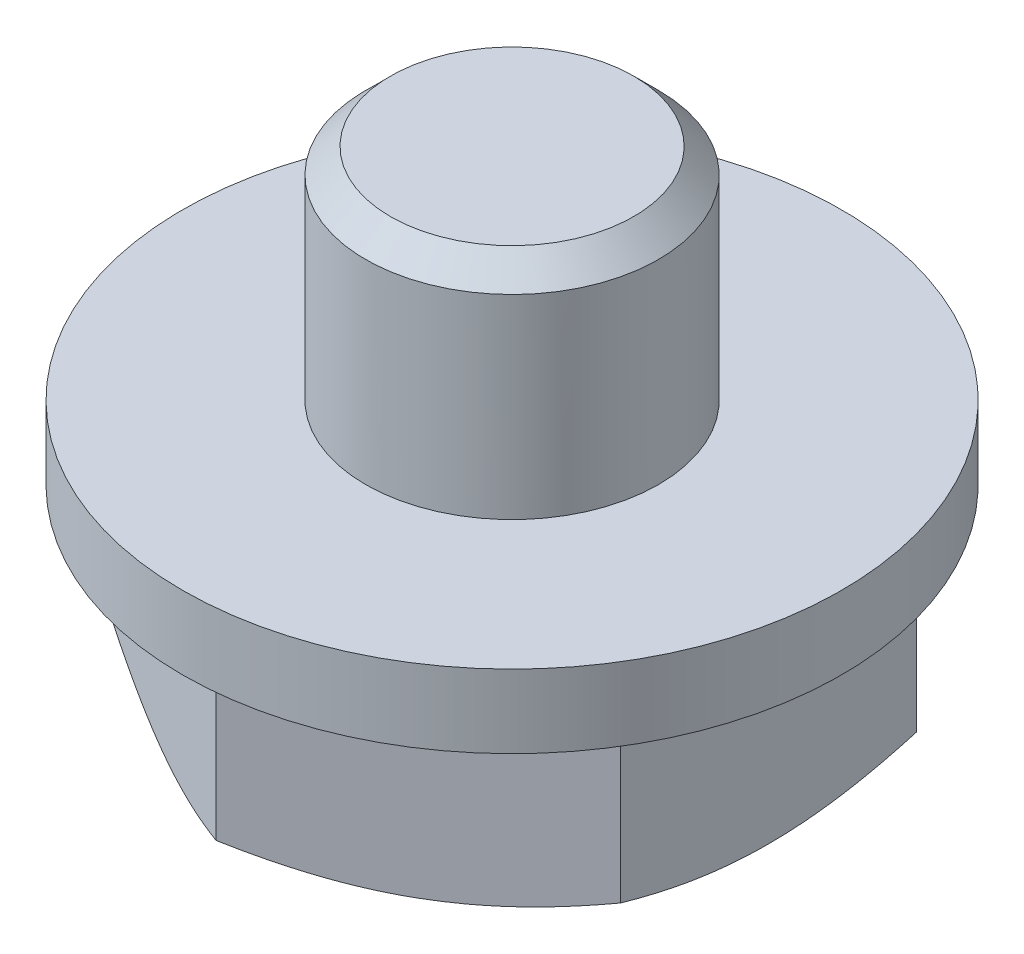
ISO-10303-21;
HEADER;
FILE_DESCRIPTION(('STEP AP214'),'2;1');
FILE_NAME('part.step','',(''),(''),'','','');
FILE_SCHEMA(('AUTOMOTIVE_DESIGN { 1 0 10303 214 1 1 1 1 }'));
ENDSEC;
DATA;
#1=APPLICATION_CONTEXT('core data for automotive mechanical design processes');
#2=APPLICATION_PROTOCOL_DEFINITION('international standard','automotive_design',2000,#1);
#3=PRODUCT_CONTEXT('',#1,'mechanical');
#4=PRODUCT('Part','Part','',(#3));
#5=PRODUCT_RELATED_PRODUCT_CATEGORY('part','',(#4));
#6=PRODUCT_DEFINITION_FORMATION('','',#4);
#7=PRODUCT_DEFINITION_CONTEXT('part definition',#1,'design');
#8=PRODUCT_DEFINITION('design','',#6,#7);
#9=PRODUCT_DEFINITION_SHAPE('','',#8);
#10=(LENGTH_UNIT() NAMED_UNIT(*) SI_UNIT(.MILLI.,.METRE.));
#11=(NAMED_UNIT(*) PLANE_ANGLE_UNIT() SI_UNIT($,.RADIAN.));
#12=(NAMED_UNIT(*) SI_UNIT($,.STERADIAN.) SOLID_ANGLE_UNIT());
#13=UNCERTAINTY_MEASURE_WITH_UNIT(LENGTH_MEASURE(1.E-05),#10,'distance_accuracy_value','');
#14=(GEOMETRIC_REPRESENTATION_CONTEXT(3) GLOBAL_UNCERTAINTY_ASSIGNED_CONTEXT((#13)) GLOBAL_UNIT_ASSIGNED_CONTEXT((#10,
#11,#12)) REPRESENTATION_CONTEXT('',''));
#15=CARTESIAN_POINT('',(0.,0.,0.));
#16=DIRECTION('',(0.,0.,1.));
#17=DIRECTION('',(1.,0.,0.));
#18=AXIS2_PLACEMENT_3D('',#15,#16,#17);
#19=CARTESIAN_POINT('',(0.,5.,8.08290376865476));
#20=DIRECTION('',(-0.5,0.,-0.866025403784438));
#21=DIRECTION('',(-0.866025403784438,0.,0.5));
#22=AXIS2_PLACEMENT_3D('',#19,#20,#21);
#23=PLANE('',#22);
#24=CARTESIAN_POINT('',(7.0002,0.625281450434499,4.04133641427354));
#25=CARTESIAN_POINT('',(6.84633209670661,0.573999847053485,4.13017208965962));
#26=CARTESIAN_POINT('',(6.69189049944575,0.525045594003585,4.21933898741225));
#27=CARTESIAN_POINT('',(6.38175307364675,0.432432787270134,4.39839691368309));
#28=CARTESIAN_POINT('',(6.22605673470458,0.388776518079361,4.48828823688318));
#29=CARTESIAN_POINT('',(5.75647483041754,0.266611592179494,4.75940147572989));
#30=CARTESIAN_POINT('',(5.4407356672622,0.19712555689495,4.94169356657133));
#31=CARTESIAN_POINT('',(4.96823775523367,0.115644956399095,5.21449036327254));
#32=CARTESIAN_POINT('',(4.81289077574251,0.0924334848814715,5.30417998369955));
#33=CARTESIAN_POINT('',(4.50149488763784,0.053511214432459,5.48396448352133));
#34=CARTESIAN_POINT('',(4.34544604227359,0.0377997527795268,5.57405932639911));
#35=CARTESIAN_POINT('',(4.03307732990483,0.0142779132830579,5.75440548657163));
#36=CARTESIAN_POINT('',(3.87675797306999,0.00645856866286302,5.84465650931977));
#37=CARTESIAN_POINT('',(3.56398349199213,-0.00111975822769417,6.02523694016572));
#38=CARTESIAN_POINT('',(3.40752837209266,-0.000878989506014234,6.11556634575577));
#39=CARTESIAN_POINT('',(2.97889312781607,0.0108597318156005,6.36303901942303));
#40=CARTESIAN_POINT('',(2.7068533171146,0.0305657427429161,6.52010127736181));
#41=CARTESIAN_POINT('',(2.1645805599178,0.0930534601257693,6.83318259970358));
#42=CARTESIAN_POINT('',(1.89434952048172,0.135856524112985,6.9892005630654));
#43=CARTESIAN_POINT('',(1.35098545806016,0.242851679710361,7.30291195077245));
#44=CARTESIAN_POINT('',(1.07792099669016,0.307497094569668,7.46056579105055));
#45=CARTESIAN_POINT('',(0.535864215009371,0.454216071847038,7.77352241987001));
#46=CARTESIAN_POINT('',(0.26686495284856,0.536255171025564,7.92882921629037));
#47=CARTESIAN_POINT('',(-0.000200000000000435,0.625281450434501,8.0830192387086));
#48=B_SPLINE_CURVE_WITH_KNOTS('',3,(#24,#25,#26,#27,#28,#29,#30,#31,#32,#33,#34,#35,#36,#37,#38,
#39,#40,#41,#42,#43,#44,#45,#46,#47),.UNSPECIFIED.,.F.,.F.,(4,2,2,2,2,2,2,2,2,2,2,4),(0.,
0.554727910214694,1.10969417576209,2.2219327402719,2.76443041023617,3.30688013473357,
3.8487128486711,4.39052882332379,5.33376515141419,6.27787517570456,7.2429241888324,
8.20607866430097),.UNSPECIFIED.);
#49=CARTESIAN_POINT('',(7.,0.625214782339281,4.04145188432738));
#50=VERTEX_POINT('',#49);
#51=CARTESIAN_POINT('',(3.5,0.,6.06217782649107));
#52=VERTEX_POINT('',#51);
#53=EDGE_CURVE('E190',#50,#52,#48,.T.);
#54=ORIENTED_EDGE('',*,*,#53,.F.);
#55=DIRECTION('',(0.,-1.,0.));
#56=VECTOR('',#55,1.);
#57=CARTESIAN_POINT('',(7.,5.,4.04145188432738));
#58=LINE('',#57,#56);
#59=CARTESIAN_POINT('',(7.,5.,4.04145188432738));
#60=VERTEX_POINT('',#59);
#61=EDGE_CURVE('E125',#60,#50,#58,.T.);
#62=ORIENTED_EDGE('',*,*,#61,.F.);
#63=DIRECTION('',(0.866025403784438,0.,-0.5));
#64=VECTOR('',#63,1.);
#65=CARTESIAN_POINT('',(0.,5.,8.08290376865476));
#66=LINE('',#65,#64);
#67=CARTESIAN_POINT('',(0.,5.,8.08290376865476));
#68=VERTEX_POINT('',#67);
#69=EDGE_CURVE('E119',#68,#60,#66,.T.);
#70=ORIENTED_EDGE('',*,*,#69,.F.);
#71=DIRECTION('',(0.,-1.,0.));
#72=VECTOR('',#71,1.);
#73=CARTESIAN_POINT('',(0.,5.,8.08290376865476));
#74=LINE('',#73,#72);
#75=CARTESIAN_POINT('',(0.,0.625214782339283,8.08290376865476));
#76=VERTEX_POINT('',#75);
#77=EDGE_CURVE('E123',#68,#76,#74,.T.);
#78=ORIENTED_EDGE('',*,*,#77,.T.);
#79=EDGE_CURVE('E195',#52,#76,#48,.T.);
#80=ORIENTED_EDGE('',*,*,#79,.F.);
#81=EDGE_LOOP('',(#54,#62,#70,#78,#80));
#82=FACE_BOUND('',#81,.T.);
#83=ADVANCED_FACE('F44',(#82),#23,.F.);
#84=CARTESIAN_POINT('',(7.,5.,4.04145188432738));
#85=DIRECTION('',(-1.,0.,0.));
#86=DIRECTION('',(0.,0.,1.));
#87=AXIS2_PLACEMENT_3D('',#84,#85,#86);
#88=PLANE('',#87);
#89=CARTESIAN_POINT('',(7.,4.76186404389195,-13.5460368372496));
#90=CARTESIAN_POINT('',(7.,4.59953780210596,-13.2295153826755));
#91=CARTESIAN_POINT('',(7.,4.4381256840516,-12.9125209039772));
#92=CARTESIAN_POINT('',(7.,4.11758692070952,-12.2773712054365));
#93=CARTESIAN_POINT('',(7.,3.95846032148225,-11.9592159623624));
#94=CARTESIAN_POINT('',(7.,3.64269167260153,-11.3210077345449));
#95=CARTESIAN_POINT('',(7.,3.48605424029042,-11.0009524611555));
#96=CARTESIAN_POINT('',(7.,3.17616592200302,-10.3591982690968));
#97=CARTESIAN_POINT('',(7.,3.02291508499555,-10.0374993267433));
#98=CARTESIAN_POINT('',(7.,2.71280106100102,-9.37545685064709));
#99=CARTESIAN_POINT('',(7.,2.55616035775235,-9.03500880298386));
#100=CARTESIAN_POINT('',(7.,2.2487810940349,-8.35147052079473));
#101=CARTESIAN_POINT('',(7.,2.09804222846701,-8.00838042395138));
#102=CARTESIAN_POINT('',(7.,1.80424349702592,-7.31918629701299));
#103=CARTESIAN_POINT('',(7.,1.66117848684679,-6.97308447144641));
#104=CARTESIAN_POINT('',(7.,1.38487440517615,-6.2768600213621));
#105=CARTESIAN_POINT('',(7.,1.25163769078746,-5.92673645543603));
#106=CARTESIAN_POINT('',(7.,0.976391123196062,-5.16146853709764));
#107=CARTESIAN_POINT('',(7.,0.836781665778038,-4.74545047840344));
#108=CARTESIAN_POINT('',(7.,0.582028097696016,-3.9060049168917));
#109=CARTESIAN_POINT('',(7.,0.466871294943943,-3.48258138201032));
#110=CARTESIAN_POINT('',(7.,0.319791842460674,-2.84573204597296));
#111=CARTESIAN_POINT('',(7.,0.275348387229164,-2.63518623620514));
#112=CARTESIAN_POINT('',(7.,0.1954774344518,-2.21237703973441));
#113=CARTESIAN_POINT('',(7.,0.160049705051499,-2.00011369734559));
#114=CARTESIAN_POINT('',(7.,0.0992290134753463,-1.57424302626459));
#115=CARTESIAN_POINT('',(7.,0.0738313681719133,-1.36063637221839));
#116=CARTESIAN_POINT('',(7.,0.0338698178703799,-0.932402784004368));
#117=CARTESIAN_POINT('',(7.,0.0193058329548889,-0.717775857374617));
#118=CARTESIAN_POINT('',(7.,0.00141701333636069,-0.285369076932571));
#119=CARTESIAN_POINT('',(7.,-0.00176554239820333,-0.0675832546729947));
#120=CARTESIAN_POINT('',(7.,0.00362428132782249,0.367840497975387));
#121=CARTESIAN_POINT('',(7.,0.0121966850484971,0.585478428058042));
#122=CARTESIAN_POINT('',(7.,0.0407823268781626,1.02006381398484));
#123=CARTESIAN_POINT('',(7.,0.0607990881427077,1.23701103650309));
#124=CARTESIAN_POINT('',(7.,0.111568807963856,1.66962460962952));
#125=CARTESIAN_POINT('',(7.,0.142322020515911,1.88529092981224));
#126=CARTESIAN_POINT('',(7.,0.250675664736702,2.53831636957404));
#127=CARTESIAN_POINT('',(7.,0.343748834818823,2.9731610376597));
#128=CARTESIAN_POINT('',(7.,0.50685007369016,3.61922913910829));
#129=CARTESIAN_POINT('',(7.,0.565146631274929,3.83359493995912));
#130=CARTESIAN_POINT('',(7.,0.688481593292126,4.26038362358347));
#131=CARTESIAN_POINT('',(7.,0.75351973266618,4.47280658238652));
#132=CARTESIAN_POINT('',(7.,0.948541479237103,5.08022368632156));
#133=CARTESIAN_POINT('',(7.,1.08570596276457,5.47290614563571));
#134=CARTESIAN_POINT('',(7.,1.37482615831473,6.25279728985024));
#135=CARTESIAN_POINT('',(7.,1.52678505575987,6.64000477527549));
#136=CARTESIAN_POINT('',(7.,1.84181886345993,7.41030073595152));
#137=CARTESIAN_POINT('',(7.,2.00490486186942,7.79338464875808));
#138=CARTESIAN_POINT('',(7.,2.33929487037032,8.55588763711016));
#139=CARTESIAN_POINT('',(7.,2.5105981529079,8.93530703354955));
#140=CARTESIAN_POINT('',(7.,2.8499471924755,9.67058271208653));
#141=CARTESIAN_POINT('',(7.,3.01765935181496,10.0265935321464));
#142=CARTESIAN_POINT('',(7.,3.35749698518692,10.7365109095522));
#143=CARTESIAN_POINT('',(7.,3.52962259093656,11.0904174037064));
#144=CARTESIAN_POINT('',(7.,3.87684626845073,11.7954295984827));
#145=CARTESIAN_POINT('',(7.,4.05193371931228,12.1465405418672));
#146=CARTESIAN_POINT('',(7.,4.40493523177394,12.8473035993393));
#147=CARTESIAN_POINT('',(7.,4.58284906047677,13.1969558306595));
#148=CARTESIAN_POINT('',(7.,4.76186404389194,13.5460368372495));
#149=B_SPLINE_CURVE_WITH_KNOTS('',3,(#89,#90,#91,#92,#93,#94,#95,#96,#97,#98,#99,#100,#101,#102,
#103,#104,#105,#106,#107,#108,#109,#110,#111,#112,#113,#114,#115,#116,#117,#118,#119,#120,#121,
#122,#123,#124,#125,#126,#127,#128,#129,#130,#131,#132,#133,#134,#135,#136,#137,#138,#139,#140,
#141,#142,#143,#144,#145,#146,#147,#148),.UNSPECIFIED.,.F.,.F.,(4,2,2,2,2,2,2,2,2,2,2,2,2,2,2,2,
2,2,2,2,2,2,2,2,2,2,2,2,2,4),(0.,1.06715956203656,2.1343406006307,3.20331244605639,
4.2722997382863,5.39652042147248,6.52068291043871,7.64408212888122,8.76774990007881,
10.0837061255838,11.3989776286479,12.0443724838111,12.6897507398901,13.3348273063576,
13.9798991141982,14.6330072977319,15.2861168291634,15.9394275292832,16.5927536860179,
17.9249922966423,18.5913824043789,19.2577463216258,20.5051467366988,21.7528163291848,
23.0017479142594,24.2505691229857,25.4311419925227,26.611750136781,27.7887710271688,
28.9656954274419),.UNSPECIFIED.);
#150=CARTESIAN_POINT('',(7.,0.625214782339283,-4.04145188432738));
#151=VERTEX_POINT('',#150);
#152=CARTESIAN_POINT('',(7.,0.,0.));
#153=VERTEX_POINT('',#152);
#154=EDGE_CURVE('E61',#151,#153,#149,.T.);
#155=ORIENTED_EDGE('',*,*,#154,.F.);
#156=DIRECTION('',(0.,-1.,0.));
#157=VECTOR('',#156,1.);
#158=CARTESIAN_POINT('',(7.,5.,-4.04145188432738));
#159=LINE('',#158,#157);
#160=CARTESIAN_POINT('',(7.,5.,-4.04145188432738));
#161=VERTEX_POINT('',#160);
#162=EDGE_CURVE('E159',#161,#151,#159,.T.);
#163=ORIENTED_EDGE('',*,*,#162,.F.);
#164=DIRECTION('',(0.,0.,-1.));
#165=VECTOR('',#164,1.);
#166=CARTESIAN_POINT('',(7.,5.,4.04145188432738));
#167=LINE('',#166,#165);
#168=EDGE_CURVE('E129',#60,#161,#167,.T.);
#169=ORIENTED_EDGE('',*,*,#168,.F.);
#170=ORIENTED_EDGE('',*,*,#61,.T.);
#171=EDGE_CURVE('E192',#153,#50,#149,.T.);
#172=ORIENTED_EDGE('',*,*,#171,.F.);
#173=EDGE_LOOP('',(#155,#163,#169,#170,#172));
#174=FACE_BOUND('',#173,.T.);
#175=ADVANCED_FACE('F257',(#174),#88,.F.);
#176=CARTESIAN_POINT('',(7.,5.,-4.04145188432738));
#177=DIRECTION('',(-0.5,0.,0.866025403784439));
#178=DIRECTION('',(0.866025403784439,0.,0.5));
#179=AXIS2_PLACEMENT_3D('',#176,#177,#178);
#180=PLANE('',#179);
#181=CARTESIAN_POINT('',(-0.000200000000000029,0.625281450434502,-8.0830192387086));
#182=CARTESIAN_POINT('',(0.153667903293392,0.573999847053488,-7.99418356332252));
#183=CARTESIAN_POINT('',(0.30810950055425,0.525045594003589,-7.90501666556989));
#184=CARTESIAN_POINT('',(0.618246926353254,0.432432787270138,-7.72595873929906));
#185=CARTESIAN_POINT('',(0.773943265295415,0.388776518079365,-7.63606741609896));
#186=CARTESIAN_POINT('',(1.24352516958246,0.266611592179497,-7.36495417725225));
#187=CARTESIAN_POINT('',(1.5592643327378,0.197125556894953,-7.18266208641081));
#188=CARTESIAN_POINT('',(2.03176224476633,0.115644956399098,-6.90986528970961));
#189=CARTESIAN_POINT('',(2.18710922425749,0.092433484881475,-6.82017566928259));
#190=CARTESIAN_POINT('',(2.49850511236216,0.0535112144324625,-6.64039116946081));
#191=CARTESIAN_POINT('',(2.65455395772641,0.0377997527795299,-6.55029632658303));
#192=CARTESIAN_POINT('',(2.96692267009517,0.0142779132830607,-6.36995016641051));
#193=CARTESIAN_POINT('',(3.12324202693001,0.00645856866286589,-6.27969914366237));
#194=CARTESIAN_POINT('',(3.43601650800788,-0.00111975822769129,-6.09911871281642));
#195=CARTESIAN_POINT('',(3.59247162790734,-0.000878989506011347,-6.00878930722637));
#196=CARTESIAN_POINT('',(4.02110687218394,0.0108597318156033,-5.76131663355911));
#197=CARTESIAN_POINT('',(4.2931466828854,0.0305657427429186,-5.60425437562033));
#198=CARTESIAN_POINT('',(4.8354194400822,0.0930534601257716,-5.29117305327856));
#199=CARTESIAN_POINT('',(5.10565047951828,0.135856524112987,-5.13515508991674));
#200=CARTESIAN_POINT('',(5.64901454193984,0.242851679710362,-4.82144370220969));
#201=CARTESIAN_POINT('',(5.92207900330984,0.30749709456967,-4.6637898619316));
#202=CARTESIAN_POINT('',(6.46413578499063,0.454216071847039,-4.35083323311213));
#203=CARTESIAN_POINT('',(6.73313504715144,0.536255171025563,-4.19552643669178));
#204=CARTESIAN_POINT('',(7.0002,0.6252814504345,-4.04133641427355));
#205=B_SPLINE_CURVE_WITH_KNOTS('',3,(#181,#182,#183,#184,#185,#186,#187,#188,#189,#190,#191,
#192,#193,#194,#195,#196,#197,#198,#199,#200,#201,#202,#203,#204),.UNSPECIFIED.,.F.,.F.,(4,2,2,
2,2,2,2,2,2,2,2,4),(0.,0.554727910214694,1.10969417576209,2.2219327402719,2.76443041023617,
3.30688013473357,3.8487128486711,4.39052882332379,5.33376515141419,6.27787517570456,
7.2429241888324,8.20607866430097),.UNSPECIFIED.);
#206=CARTESIAN_POINT('',(0.,0.625214782339285,-8.08290376865476));
#207=VERTEX_POINT('',#206);
#208=CARTESIAN_POINT('',(3.5,0.,-6.06217782649107));
#209=VERTEX_POINT('',#208);
#210=EDGE_CURVE('E69',#207,#209,#205,.T.);
#211=ORIENTED_EDGE('',*,*,#210,.F.);
#212=DIRECTION('',(0.,-1.,0.));
#213=VECTOR('',#212,1.);
#214=CARTESIAN_POINT('',(0.,5.,-8.08290376865476));
#215=LINE('',#214,#213);
#216=CARTESIAN_POINT('',(0.,5.,-8.08290376865476));
#217=VERTEX_POINT('',#216);
#218=EDGE_CURVE('E156',#217,#207,#215,.T.);
#219=ORIENTED_EDGE('',*,*,#218,.F.);
#220=DIRECTION('',(-0.866025403784439,0.,-0.5));
#221=VECTOR('',#220,1.);
#222=CARTESIAN_POINT('',(7.,5.,-4.04145188432738));
#223=LINE('',#222,#221);
#224=EDGE_CURVE('E267',#161,#217,#223,.T.);
#225=ORIENTED_EDGE('',*,*,#224,.F.);
#226=ORIENTED_EDGE('',*,*,#162,.T.);
#227=EDGE_CURVE('E226',#209,#151,#205,.T.);
#228=ORIENTED_EDGE('',*,*,#227,.F.);
#229=EDGE_LOOP('',(#211,#219,#225,#226,#228));
#230=FACE_BOUND('',#229,.T.);
#231=ADVANCED_FACE('F252',(#230),#180,.F.);
#232=CARTESIAN_POINT('',(0.,5.,-8.08290376865476));
#233=DIRECTION('',(0.5,0.,0.866025403784438));
#234=DIRECTION('',(0.866025403784439,0.,-0.5));
#235=AXIS2_PLACEMENT_3D('',#232,#233,#234);
#236=PLANE('',#235);
#237=CARTESIAN_POINT('',(-7.0002,0.6252814504345,-4.04133641427354));
#238=CARTESIAN_POINT('',(-6.84633209670661,0.573999847053487,-4.13017208965963));
#239=CARTESIAN_POINT('',(-6.69189049944575,0.525045594003588,-4.21933898741226));
#240=CARTESIAN_POINT('',(-6.38175307364675,0.432432787270136,-4.39839691368309));
#241=CARTESIAN_POINT('',(-6.22605673470458,0.388776518079363,-4.48828823688319));
#242=CARTESIAN_POINT('',(-5.75647483041754,0.266611592179495,-4.75940147572989));
#243=CARTESIAN_POINT('',(-5.4407356672622,0.197125556894951,-4.94169356657133));
#244=CARTESIAN_POINT('',(-4.96823775523367,0.115644956399097,-5.21449036327254));
#245=CARTESIAN_POINT('',(-4.81289077574251,0.0924334848814738,-5.30417998369956));
#246=CARTESIAN_POINT('',(-4.50149488763784,0.0535112144324617,-5.48396448352133));
#247=CARTESIAN_POINT('',(-4.34544604227359,0.0377997527795295,-5.57405932639911));
#248=CARTESIAN_POINT('',(-4.03307732990483,0.0142779132830601,-5.75440548657163));
#249=CARTESIAN_POINT('',(-3.87675797306999,0.00645856866286484,-5.84465650931978));
#250=CARTESIAN_POINT('',(-3.56398349199212,-0.00111975822769248,-6.02523694016573));
#251=CARTESIAN_POINT('',(-3.40752837209266,-0.00087898950601225,-6.11556634575578));
#252=CARTESIAN_POINT('',(-2.97889312781606,0.0108597318156028,-6.36303901942303));
#253=CARTESIAN_POINT('',(-2.7068533171146,0.0305657427429182,-6.52010127736182));
#254=CARTESIAN_POINT('',(-2.1645805599178,0.0930534601257714,-6.83318259970359));
#255=CARTESIAN_POINT('',(-1.89434952048172,0.135856524112987,-6.9892005630654));
#256=CARTESIAN_POINT('',(-1.35098545806016,0.242851679710363,-7.30291195077246));
#257=CARTESIAN_POINT('',(-1.07792099669016,0.30749709456967,-7.46056579105055));
#258=CARTESIAN_POINT('',(-0.535864215009371,0.45421607184704,-7.77352241987002));
#259=CARTESIAN_POINT('',(-0.26686495284856,0.536255171025565,-7.92882921629037));
#260=CARTESIAN_POINT('',(0.000200000000000149,0.625281450434503,-8.0830192387086));
#261=B_SPLINE_CURVE_WITH_KNOTS('',3,(#237,#238,#239,#240,#241,#242,#243,#244,#245,#246,#247,
#248,#249,#250,#251,#252,#253,#254,#255,#256,#257,#258,#259,#260),.UNSPECIFIED.,.F.,.F.,(4,2,2,
2,2,2,2,2,2,2,2,4),(0.,0.554727910214694,1.10969417576209,2.2219327402719,2.76443041023617,
3.30688013473357,3.8487128486711,4.39052882332379,5.33376515141419,6.27787517570456,
7.2429241888324,8.20607866430097),.UNSPECIFIED.);
#262=CARTESIAN_POINT('',(-7.,0.625214782339253,-4.04145188432743));
#263=VERTEX_POINT('',#262);
#264=CARTESIAN_POINT('',(-3.5,0.,-6.06217782649107));
#265=VERTEX_POINT('',#264);
#266=EDGE_CURVE('E181',#263,#265,#261,.T.);
#267=ORIENTED_EDGE('',*,*,#266,.F.);
#268=DIRECTION('',(0.,-1.,0.));
#269=VECTOR('',#268,1.);
#270=CARTESIAN_POINT('',(-7.,5.,-4.04145188432738));
#271=LINE('',#270,#269);
#272=CARTESIAN_POINT('',(-7.,5.,-4.04145188432738));
#273=VERTEX_POINT('',#272);
#274=EDGE_CURVE('E153',#273,#263,#271,.T.);
#275=ORIENTED_EDGE('',*,*,#274,.F.);
#276=DIRECTION('',(-0.866025403784439,0.,0.5));
#277=VECTOR('',#276,1.);
#278=CARTESIAN_POINT('',(0.,5.,-8.08290376865476));
#279=LINE('',#278,#277);
#280=EDGE_CURVE('E148',#217,#273,#279,.T.);
#281=ORIENTED_EDGE('',*,*,#280,.F.);
#282=ORIENTED_EDGE('',*,*,#218,.T.);
#283=EDGE_CURVE('E194',#265,#207,#261,.T.);
#284=ORIENTED_EDGE('',*,*,#283,.F.);
#285=EDGE_LOOP('',(#267,#275,#281,#282,#284));
#286=FACE_BOUND('',#285,.T.);
#287=ADVANCED_FACE('F249',(#286),#236,.F.);
#288=CARTESIAN_POINT('',(-7.,5.,-4.04145188432738));
#289=DIRECTION('',(1.,0.,0.));
#290=DIRECTION('',(0.,0.,-1.));
#291=AXIS2_PLACEMENT_3D('',#288,#289,#290);
#292=PLANE('',#291);
#293=CARTESIAN_POINT('',(-7.,4.76186404389195,13.5460368372496));
#294=CARTESIAN_POINT('',(-7.,4.59953780210596,13.2295153826755));
#295=CARTESIAN_POINT('',(-7.,4.4381256840516,12.9125209039772));
#296=CARTESIAN_POINT('',(-7.,4.11758692070952,12.2773712054365));
#297=CARTESIAN_POINT('',(-7.,3.95846032148225,11.9592159623624));
#298=CARTESIAN_POINT('',(-7.,3.64269167260153,11.3210077345449));
#299=CARTESIAN_POINT('',(-7.,3.48605424029042,11.0009524611555));
#300=CARTESIAN_POINT('',(-7.,3.17616592200302,10.3591982690968));
#301=CARTESIAN_POINT('',(-7.,3.02291508499555,10.0374993267433));
#302=CARTESIAN_POINT('',(-7.,2.71280106100102,9.37545685064709));
#303=CARTESIAN_POINT('',(-7.,2.55616035775235,9.03500880298386));
#304=CARTESIAN_POINT('',(-7.,2.2487810940349,8.35147052079473));
#305=CARTESIAN_POINT('',(-7.,2.09804222846701,8.00838042395138));
#306=CARTESIAN_POINT('',(-7.,1.80424349702592,7.319186297013));
#307=CARTESIAN_POINT('',(-7.,1.66117848684679,6.97308447144641));
#308=CARTESIAN_POINT('',(-7.,1.38487440517615,6.2768600213621));
#309=CARTESIAN_POINT('',(-7.,1.25163769078747,5.92673645543603));
#310=CARTESIAN_POINT('',(-7.,0.976391123196062,5.16146853709764));
#311=CARTESIAN_POINT('',(-7.,0.836781665778038,4.74545047840344));
#312=CARTESIAN_POINT('',(-7.,0.582028097696016,3.9060049168917));
#313=CARTESIAN_POINT('',(-7.,0.466871294943943,3.48258138201032));
#314=CARTESIAN_POINT('',(-7.,0.319791842460674,2.84573204597296));
#315=CARTESIAN_POINT('',(-7.,0.275348387229164,2.63518623620514));
#316=CARTESIAN_POINT('',(-7.,0.1954774344518,2.21237703973441));
#317=CARTESIAN_POINT('',(-7.,0.160049705051499,2.00011369734559));
#318=CARTESIAN_POINT('',(-7.,0.0992290134753463,1.57424302626459));
#319=CARTESIAN_POINT('',(-7.,0.0738313681719133,1.36063637221839));
#320=CARTESIAN_POINT('',(-7.,0.0338698178703799,0.932402784004368));
#321=CARTESIAN_POINT('',(-7.,0.0193058329548889,0.717775857374617));
#322=CARTESIAN_POINT('',(-7.,0.00141701333636068,0.285369076932571));
#323=CARTESIAN_POINT('',(-7.,-0.00176554239820333,0.0675832546729948));
#324=CARTESIAN_POINT('',(-7.,0.00362428132782249,-0.367840497975387));
#325=CARTESIAN_POINT('',(-7.,0.0121966850484971,-0.585478428058042));
#326=CARTESIAN_POINT('',(-7.,0.0407823268781626,-1.02006381398484));
#327=CARTESIAN_POINT('',(-7.,0.0607990881427077,-1.23701103650309));
#328=CARTESIAN_POINT('',(-7.,0.111568807963856,-1.66962460962952));
#329=CARTESIAN_POINT('',(-7.,0.142322020515911,-1.88529092981224));
#330=CARTESIAN_POINT('',(-7.,0.250675664736702,-2.53831636957404));
#331=CARTESIAN_POINT('',(-7.,0.343748834818823,-2.9731610376597));
#332=CARTESIAN_POINT('',(-7.,0.50685007369016,-3.61922913910829));
#333=CARTESIAN_POINT('',(-7.,0.565146631274929,-3.83359493995912));
#334=CARTESIAN_POINT('',(-7.,0.688481593292126,-4.26038362358347));
#335=CARTESIAN_POINT('',(-7.,0.75351973266618,-4.47280658238652));
#336=CARTESIAN_POINT('',(-7.,0.948541479237103,-5.08022368632156));
#337=CARTESIAN_POINT('',(-7.,1.08570596276457,-5.47290614563571));
#338=CARTESIAN_POINT('',(-7.,1.37482615831473,-6.25279728985024));
#339=CARTESIAN_POINT('',(-7.,1.52678505575987,-6.64000477527549));
#340=CARTESIAN_POINT('',(-7.,1.84181886345993,-7.41030073595152));
#341=CARTESIAN_POINT('',(-7.,2.00490486186942,-7.79338464875808));
#342=CARTESIAN_POINT('',(-7.,2.33929487037032,-8.55588763711016));
#343=CARTESIAN_POINT('',(-7.,2.5105981529079,-8.93530703354955));
#344=CARTESIAN_POINT('',(-7.,2.8499471924755,-9.67058271208653));
#345=CARTESIAN_POINT('',(-7.,3.01765935181496,-10.0265935321464));
#346=CARTESIAN_POINT('',(-7.,3.35749698518692,-10.7365109095522));
#347=CARTESIAN_POINT('',(-7.,3.52962259093656,-11.0904174037064));
#348=CARTESIAN_POINT('',(-7.,3.87684626845073,-11.7954295984827));
#349=CARTESIAN_POINT('',(-7.,4.05193371931229,-12.1465405418672));
#350=CARTESIAN_POINT('',(-7.,4.40493523177395,-12.8473035993394));
#351=CARTESIAN_POINT('',(-7.,4.58284906047678,-13.1969558306596));
#352=CARTESIAN_POINT('',(-7.,4.76186404389195,-13.5460368372496));
#353=B_SPLINE_CURVE_WITH_KNOTS('',3,(#293,#294,#295,#296,#297,#298,#299,#300,#301,#302,#303,
#304,#305,#306,#307,#308,#309,#310,#311,#312,#313,#314,#315,#316,#317,#318,#319,#320,#321,#322,
#323,#324,#325,#326,#327,#328,#329,#330,#331,#332,#333,#334,#335,#336,#337,#338,#339,#340,#341,
#342,#343,#344,#345,#346,#347,#348,#349,#350,#351,#352),.UNSPECIFIED.,.F.,.F.,(4,2,2,2,2,2,2,2,
2,2,2,2,2,2,2,2,2,2,2,2,2,2,2,2,2,2,2,2,2,4),(0.,1.06715956203656,2.1343406006307,
3.20331244605639,4.2722997382863,5.39652042147248,6.52068291043871,7.64408212888122,
8.76774990007881,10.0837061255838,11.3989776286479,12.0443724838111,12.6897507398901,
13.3348273063576,13.9798991141982,14.6330072977319,15.2861168291634,15.9394275292832,
16.5927536860179,17.9249922966423,18.5913824043789,19.2577463216258,20.5051467366988,
21.7528163291848,23.0017479142594,24.2505691229858,25.4311419925227,26.611750136781,
27.7887710271688,28.9656954274419),.UNSPECIFIED.);
#354=CARTESIAN_POINT('',(-7.,0.625214782339282,4.04145188432738));
#355=VERTEX_POINT('',#354);
#356=CARTESIAN_POINT('',(-7.,0.,0.));
#357=VERTEX_POINT('',#356);
#358=EDGE_CURVE('E189',#355,#357,#353,.T.);
#359=ORIENTED_EDGE('',*,*,#358,.F.);
#360=DIRECTION('',(0.,-1.,0.));
#361=VECTOR('',#360,1.);
#362=CARTESIAN_POINT('',(-7.,5.,4.04145188432738));
#363=LINE('',#362,#361);
#364=CARTESIAN_POINT('',(-7.,5.,4.04145188432738));
#365=VERTEX_POINT('',#364);
#366=EDGE_CURVE('E141',#365,#355,#363,.T.);
#367=ORIENTED_EDGE('',*,*,#366,.F.);
#368=DIRECTION('',(0.,0.,1.));
#369=VECTOR('',#368,1.);
#370=CARTESIAN_POINT('',(-7.,5.,-4.04145188432738));
#371=LINE('',#370,#369);
#372=EDGE_CURVE('E146',#273,#365,#371,.T.);
#373=ORIENTED_EDGE('',*,*,#372,.F.);
#374=ORIENTED_EDGE('',*,*,#274,.T.);
#375=EDGE_CURVE('E179',#357,#263,#353,.T.);
#376=ORIENTED_EDGE('',*,*,#375,.F.);
#377=EDGE_LOOP('',(#359,#367,#373,#374,#376));
#378=FACE_BOUND('',#377,.T.);
#379=ADVANCED_FACE('F188',(#378),#292,.F.);
#380=CARTESIAN_POINT('',(-7.,5.,4.04145188432738));
#381=DIRECTION('',(0.5,0.,-0.866025403784439));
#382=DIRECTION('',(-0.866025403784439,0.,-0.5));
#383=AXIS2_PLACEMENT_3D('',#380,#381,#382);
#384=PLANE('',#383);
#385=CARTESIAN_POINT('',(0.0002,0.625281450434501,8.0830192387086));
#386=CARTESIAN_POINT('',(-0.153667903293392,0.573999847053487,7.99418356332252));
#387=CARTESIAN_POINT('',(-0.308109500554251,0.525045594003587,7.90501666556988));
#388=CARTESIAN_POINT('',(-0.618246926353256,0.432432787270136,7.72595873929905));
#389=CARTESIAN_POINT('',(-0.773943265295416,0.388776518079362,7.63606741609896));
#390=CARTESIAN_POINT('',(-1.24352516958246,0.266611592179495,7.36495417725225));
#391=CARTESIAN_POINT('',(-1.5592643327378,0.197125556894951,7.18266208641081));
#392=CARTESIAN_POINT('',(-2.03176224476633,0.115644956399097,6.9098652897096));
#393=CARTESIAN_POINT('',(-2.18710922425749,0.0924334848814734,6.82017566928259));
#394=CARTESIAN_POINT('',(-2.49850511236216,0.0535112144324611,6.64039116946081));
#395=CARTESIAN_POINT('',(-2.65455395772641,0.0377997527795285,6.55029632658303));
#396=CARTESIAN_POINT('',(-2.96692267009517,0.0142779132830592,6.36995016641051));
#397=CARTESIAN_POINT('',(-3.12324202693001,0.00645856866286434,6.27969914366237));
#398=CARTESIAN_POINT('',(-3.43601650800788,-0.00111975822769298,6.09911871281642));
#399=CARTESIAN_POINT('',(-3.59247162790734,-0.000878989506013206,6.00878930722637));
#400=CARTESIAN_POINT('',(-4.02110687218394,0.0108597318156014,5.76131663355911));
#401=CARTESIAN_POINT('',(-4.2931466828854,0.0305657427429173,5.60425437562033));
#402=CARTESIAN_POINT('',(-4.8354194400822,0.0930534601257706,5.29117305327856));
#403=CARTESIAN_POINT('',(-5.10565047951828,0.135856524112986,5.13515508991674));
#404=CARTESIAN_POINT('',(-5.64901454193984,0.242851679710361,4.82144370220969));
#405=CARTESIAN_POINT('',(-5.92207900330984,0.307497094569669,4.66378986193159));
#406=CARTESIAN_POINT('',(-6.46413578499063,0.454216071847039,4.35083323311213));
#407=CARTESIAN_POINT('',(-6.73313504715144,0.536255171025563,4.19552643669177));
#408=CARTESIAN_POINT('',(-7.0002,0.6252814504345,4.04133641427354));
#409=B_SPLINE_CURVE_WITH_KNOTS('',3,(#385,#386,#387,#388,#389,#390,#391,#392,#393,#394,#395,
#396,#397,#398,#399,#400,#401,#402,#403,#404,#405,#406,#407,#408),.UNSPECIFIED.,.F.,.F.,(4,2,2,
2,2,2,2,2,2,2,2,4),(0.,0.554727910214696,1.10969417576209,2.2219327402719,2.76443041023617,
3.30688013473357,3.8487128486711,4.39052882332379,5.33376515141419,6.27787517570456,
7.2429241888324,8.20607866430097),.UNSPECIFIED.);
#410=CARTESIAN_POINT('',(-3.5,0.,6.06217782649107));
#411=VERTEX_POINT('',#410);
#412=EDGE_CURVE('E140',#76,#411,#409,.T.);
#413=ORIENTED_EDGE('',*,*,#412,.F.);
#414=ORIENTED_EDGE('',*,*,#77,.F.);
#415=DIRECTION('',(0.866025403784439,0.,0.5));
#416=VECTOR('',#415,1.);
#417=CARTESIAN_POINT('',(-7.,5.,4.04145188432738));
#418=LINE('',#417,#416);
#419=EDGE_CURVE('E136',#365,#68,#418,.T.);
#420=ORIENTED_EDGE('',*,*,#419,.F.);
#421=ORIENTED_EDGE('',*,*,#366,.T.);
#422=EDGE_CURVE('E204',#411,#355,#409,.T.);
#423=ORIENTED_EDGE('',*,*,#422,.F.);
#424=EDGE_LOOP('',(#413,#414,#420,#421,#423));
#425=FACE_BOUND('',#424,.T.);
#426=ADVANCED_FACE('F134',(#425),#384,.F.);
#427=CARTESIAN_POINT('',(0.,0.,0.));
#428=DIRECTION('',(0.,1.,0.));
#429=DIRECTION('',(0.,0.,-1.));
#430=AXIS2_PLACEMENT_3D('',#427,#428,#429);
#431=CONICAL_SURFACE('',#430,7.,1.0471975511966);
#432=ORIENTED_EDGE('',*,*,#79,.T.);
#433=ORIENTED_EDGE('',*,*,#412,.T.);
#434=CARTESIAN_POINT('',(0.,0.,0.));
#435=DIRECTION('',(0.,1.,0.));
#436=DIRECTION('',(0.,0.,1.));
#437=AXIS2_PLACEMENT_3D('',#434,#435,#436);
#438=CIRCLE('',#437,7.);
#439=EDGE_CURVE('E48',#411,#52,#438,.T.);
#440=ORIENTED_EDGE('',*,*,#439,.T.);
#441=EDGE_LOOP('',(#432,#433,#440));
#442=FACE_BOUND('',#441,.T.);
#443=ADVANCED_FACE('F272',(#442),#431,.T.);
#444=ORIENTED_EDGE('',*,*,#358,.T.);
#445=EDGE_CURVE('E164',#357,#411,#438,.T.);
#446=ORIENTED_EDGE('',*,*,#445,.T.);
#447=ORIENTED_EDGE('',*,*,#422,.T.);
#448=EDGE_LOOP('',(#444,#446,#447));
#449=FACE_BOUND('',#448,.T.);
#450=ADVANCED_FACE('F220',(#449),#431,.T.);
#451=ORIENTED_EDGE('',*,*,#266,.T.);
#452=EDGE_CURVE('E168',#265,#357,#438,.T.);
#453=ORIENTED_EDGE('',*,*,#452,.T.);
#454=ORIENTED_EDGE('',*,*,#375,.T.);
#455=EDGE_LOOP('',(#451,#453,#454));
#456=FACE_BOUND('',#455,.T.);
#457=ADVANCED_FACE('F177',(#456),#431,.T.);
#458=ORIENTED_EDGE('',*,*,#210,.T.);
#459=EDGE_CURVE('E169',#209,#265,#438,.T.);
#460=ORIENTED_EDGE('',*,*,#459,.T.);
#461=ORIENTED_EDGE('',*,*,#283,.T.);
#462=EDGE_LOOP('',(#458,#460,#461));
#463=FACE_BOUND('',#462,.T.);
#464=ADVANCED_FACE('F215',(#463),#431,.T.);
#465=ORIENTED_EDGE('',*,*,#227,.T.);
#466=ORIENTED_EDGE('',*,*,#154,.T.);
#467=CARTESIAN_POINT('',(0.,0.,0.));
#468=DIRECTION('',(0.,-1.,0.));
#469=DIRECTION('',(0.,0.,-1.));
#470=AXIS2_PLACEMENT_3D('',#467,#468,#469);
#471=CIRCLE('',#470,7.);
#472=EDGE_CURVE('E205',#209,#153,#471,.T.);
#473=ORIENTED_EDGE('',*,*,#472,.F.);
#474=EDGE_LOOP('',(#465,#466,#473));
#475=FACE_BOUND('',#474,.T.);
#476=ADVANCED_FACE('F219',(#475),#431,.T.);
#477=ORIENTED_EDGE('',*,*,#171,.T.);
#478=ORIENTED_EDGE('',*,*,#53,.T.);
#479=EDGE_CURVE('E53',#52,#153,#438,.T.);
#480=ORIENTED_EDGE('',*,*,#479,.T.);
#481=EDGE_LOOP('',(#477,#478,#480));
#482=FACE_BOUND('',#481,.T.);
#483=ADVANCED_FACE('F277',(#482),#431,.T.);
#484=CARTESIAN_POINT('',(0.,0.,0.));
#485=DIRECTION('',(0.,1.,0.));
#486=DIRECTION('',(0.,0.,1.));
#487=AXIS2_PLACEMENT_3D('',#484,#485,#486);
#488=PLANE('',#487);
#489=ORIENTED_EDGE('',*,*,#479,.F.);
#490=ORIENTED_EDGE('',*,*,#439,.F.);
#491=ORIENTED_EDGE('',*,*,#445,.F.);
#492=ORIENTED_EDGE('',*,*,#452,.F.);
#493=ORIENTED_EDGE('',*,*,#459,.F.);
#494=ORIENTED_EDGE('',*,*,#472,.T.);
#495=EDGE_LOOP('',(#489,#490,#491,#492,#493,#494));
#496=FACE_BOUND('',#495,.T.);
#497=ADVANCED_FACE('F184',(#496),#488,.F.);
#498=CARTESIAN_POINT('',(0.,5.,0.));
#499=DIRECTION('',(0.,1.,0.));
#500=DIRECTION('',(0.,0.,1.));
#501=AXIS2_PLACEMENT_3D('',#498,#499,#500);
#502=PLANE('',#501);
#503=CARTESIAN_POINT('',(0.,5.,0.));
#504=DIRECTION('',(0.,1.,0.));
#505=DIRECTION('',(0.,0.,1.));
#506=AXIS2_PLACEMENT_3D('',#503,#504,#505);
#507=CIRCLE('',#506,9.);
#508=CARTESIAN_POINT('',(0.,5.,9.));
#509=VERTEX_POINT('',#508);
#510=EDGE_CURVE('E290',#509,#509,#507,.T.);
#511=ORIENTED_EDGE('',*,*,#510,.F.);
#512=EDGE_LOOP('',(#511));
#513=FACE_BOUND('',#512,.T.);
#514=ORIENTED_EDGE('',*,*,#419,.T.);
#515=ORIENTED_EDGE('',*,*,#69,.T.);
#516=ORIENTED_EDGE('',*,*,#168,.T.);
#517=ORIENTED_EDGE('',*,*,#224,.T.);
#518=ORIENTED_EDGE('',*,*,#280,.T.);
#519=ORIENTED_EDGE('',*,*,#372,.T.);
#520=EDGE_LOOP('',(#514,#515,#516,#517,#518,#519));
#521=FACE_BOUND('',#520,.T.);
#522=ADVANCED_FACE('F143',(#513,#521),#502,.F.);
#523=CARTESIAN_POINT('',(0.,7.,0.));
#524=DIRECTION('',(0.,-1.,0.));
#525=DIRECTION('',(0.,0.,-1.));
#526=AXIS2_PLACEMENT_3D('',#523,#524,#525);
#527=CYLINDRICAL_SURFACE('',#526,9.);
#528=CARTESIAN_POINT('',(0.,7.,0.));
#529=DIRECTION('',(0.,1.,0.));
#530=DIRECTION('',(0.,0.,1.));
#531=AXIS2_PLACEMENT_3D('',#528,#529,#530);
#532=CIRCLE('',#531,9.);
#533=CARTESIAN_POINT('',(0.,7.,9.));
#534=VERTEX_POINT('',#533);
#535=EDGE_CURVE('E288',#534,#534,#532,.T.);
#536=ORIENTED_EDGE('',*,*,#535,.F.);
#537=EDGE_LOOP('',(#536));
#538=FACE_BOUND('',#537,.T.);
#539=ORIENTED_EDGE('',*,*,#510,.T.);
#540=EDGE_LOOP('',(#539));
#541=FACE_BOUND('',#540,.T.);
#542=ADVANCED_FACE('F221',(#538,#541),#527,.T.);
#543=CARTESIAN_POINT('',(0.,7.,0.));
#544=DIRECTION('',(0.,1.,0.));
#545=DIRECTION('',(0.,0.,1.));
#546=AXIS2_PLACEMENT_3D('',#543,#544,#545);
#547=PLANE('',#546);
#548=CARTESIAN_POINT('',(0.,7.,0.));
#549=DIRECTION('',(0.,1.,0.));
#550=DIRECTION('',(0.,0.,1.));
#551=AXIS2_PLACEMENT_3D('',#548,#549,#550);
#552=CIRCLE('',#551,4.);
#553=CARTESIAN_POINT('',(0.,7.,4.));
#554=VERTEX_POINT('',#553);
#555=EDGE_CURVE('E12',#554,#554,#552,.T.);
#556=ORIENTED_EDGE('',*,*,#555,.F.);
#557=EDGE_LOOP('',(#556));
#558=FACE_BOUND('',#557,.T.);
#559=ORIENTED_EDGE('',*,*,#535,.T.);
#560=EDGE_LOOP('',(#559));
#561=FACE_BOUND('',#560,.T.);
#562=ADVANCED_FACE('F318',(#558,#561),#547,.T.);
#563=CARTESIAN_POINT('',(0.,13.,0.));
#564=DIRECTION('',(0.,-1.,0.));
#565=DIRECTION('',(0.,0.,-1.));
#566=AXIS2_PLACEMENT_3D('',#563,#564,#565);
#567=CYLINDRICAL_SURFACE('',#566,4.);
#568=CARTESIAN_POINT('',(0.,12.3235,0.));
#569=DIRECTION('',(0.,-1.,0.));
#570=DIRECTION('',(0.,0.,-1.));
#571=AXIS2_PLACEMENT_3D('',#568,#569,#570);
#572=CIRCLE('',#571,4.);
#573=CARTESIAN_POINT('',(0.,12.3235,-4.));
#574=VERTEX_POINT('',#573);
#575=EDGE_CURVE('E295',#574,#574,#572,.T.);
#576=ORIENTED_EDGE('',*,*,#575,.T.);
#577=EDGE_LOOP('',(#576));
#578=FACE_BOUND('',#577,.T.);
#579=ORIENTED_EDGE('',*,*,#555,.T.);
#580=EDGE_LOOP('',(#579));
#581=FACE_BOUND('',#580,.T.);
#582=ADVANCED_FACE('F312',(#578,#581),#567,.T.);
#583=CARTESIAN_POINT('',(0.,13.,0.));
#584=DIRECTION('',(0.,-1.,0.));
#585=DIRECTION('',(0.,0.,-1.));
#586=AXIS2_PLACEMENT_3D('',#583,#584,#585);
#587=CONICAL_SURFACE('',#586,3.3235,0.785398163397453);
#588=ORIENTED_EDGE('',*,*,#575,.F.);
#589=EDGE_LOOP('',(#588));
#590=FACE_BOUND('',#589,.T.);
#591=CARTESIAN_POINT('',(0.,13.,0.));
#592=DIRECTION('',(0.,-1.,0.));
#593=DIRECTION('',(0.,0.,-1.));
#594=AXIS2_PLACEMENT_3D('',#591,#592,#593);
#595=CIRCLE('',#594,3.3235);
#596=CARTESIAN_POINT('',(0.,13.,-3.3235));
#597=VERTEX_POINT('',#596);
#598=EDGE_CURVE('E299',#597,#597,#595,.T.);
#599=ORIENTED_EDGE('',*,*,#598,.T.);
#600=EDGE_LOOP('',(#599));
#601=FACE_BOUND('',#600,.T.);
#602=ADVANCED_FACE('F303',(#590,#601),#587,.T.);
#603=CARTESIAN_POINT('',(0.,13.,0.));
#604=DIRECTION('',(0.,1.,0.));
#605=DIRECTION('',(0.,0.,1.));
#606=AXIS2_PLACEMENT_3D('',#603,#604,#605);
#607=PLANE('',#606);
#608=ORIENTED_EDGE('',*,*,#598,.F.);
#609=EDGE_LOOP('',(#608));
#610=FACE_BOUND('',#609,.T.);
#611=ADVANCED_FACE('F305',(#610),#607,.T.);
#612=CLOSED_SHELL('',(#83,#175,#231,#287,#379,#426,#443,#450,#457,#464,#476,#483,#497,#522,#542,
#562,#582,#602,#611));
#613=MANIFOLD_SOLID_BREP('B2',#612);
#614=ADVANCED_BREP_SHAPE_REPRESENTATION('',(#18,#613),#14);
#615=SHAPE_DEFINITION_REPRESENTATION(#9,#614);
ENDSEC;
END-ISO-10303-21;
